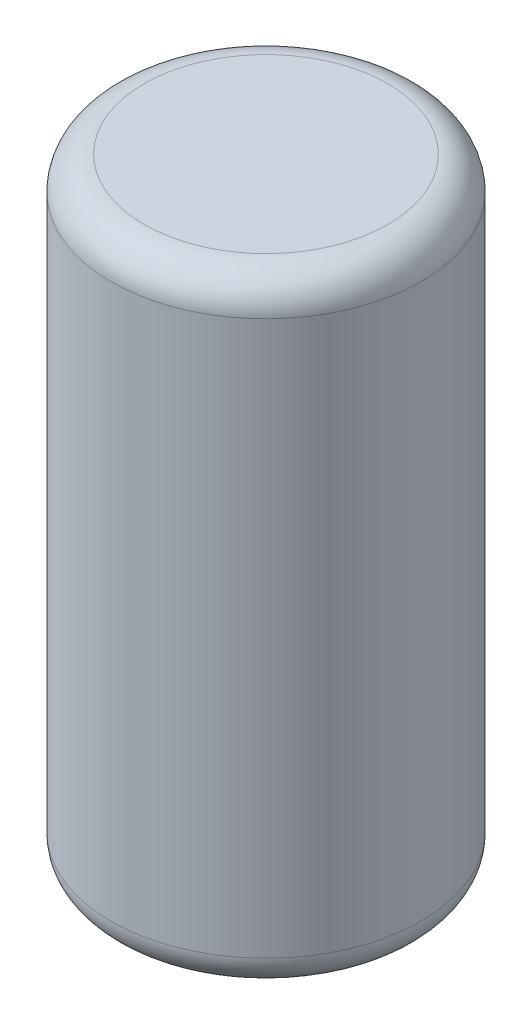
ISO-10303-21;
HEADER;
FILE_DESCRIPTION(('STEP AP214'),'2;1');
FILE_NAME('part.step','',(''),(''),'','','');
FILE_SCHEMA(('AUTOMOTIVE_DESIGN { 1 0 10303 214 1 1 1 1 }'));
ENDSEC;
DATA;
#1=APPLICATION_CONTEXT('core data for automotive mechanical design processes');
#2=APPLICATION_PROTOCOL_DEFINITION('international standard','automotive_design',2000,#1);
#3=PRODUCT_CONTEXT('',#1,'mechanical');
#4=PRODUCT('Part','Part','',(#3));
#5=PRODUCT_RELATED_PRODUCT_CATEGORY('part','',(#4));
#6=PRODUCT_DEFINITION_FORMATION('','',#4);
#7=PRODUCT_DEFINITION_CONTEXT('part definition',#1,'design');
#8=PRODUCT_DEFINITION('design','',#6,#7);
#9=PRODUCT_DEFINITION_SHAPE('','',#8);
#10=(LENGTH_UNIT() NAMED_UNIT(*) SI_UNIT(.MILLI.,.METRE.));
#11=(NAMED_UNIT(*) PLANE_ANGLE_UNIT() SI_UNIT($,.RADIAN.));
#12=(NAMED_UNIT(*) SI_UNIT($,.STERADIAN.) SOLID_ANGLE_UNIT());
#13=UNCERTAINTY_MEASURE_WITH_UNIT(LENGTH_MEASURE(1.E-05),#10,'distance_accuracy_value','');
#14=(GEOMETRIC_REPRESENTATION_CONTEXT(3) GLOBAL_UNCERTAINTY_ASSIGNED_CONTEXT((#13)) GLOBAL_UNIT_ASSIGNED_CONTEXT((#10,
#11,#12)) REPRESENTATION_CONTEXT('',''));
#15=CARTESIAN_POINT('',(0.,0.,0.));
#16=DIRECTION('',(0.,0.,1.));
#17=DIRECTION('',(1.,0.,0.));
#18=AXIS2_PLACEMENT_3D('',#15,#16,#17);
#19=CARTESIAN_POINT('',(0.,4.7625,0.));
#20=DIRECTION('',(0.,-1.,0.));
#21=DIRECTION('',(0.,0.,-1.));
#22=AXIS2_PLACEMENT_3D('',#19,#20,#21);
#23=CYLINDRICAL_SURFACE('',#22,1.190625);
#24=CARTESIAN_POINT('',(0.,0.253999999999999,0.));
#25=DIRECTION('',(0.,1.,0.));
#26=DIRECTION('',(0.,0.,1.));
#27=AXIS2_PLACEMENT_3D('',#24,#25,#26);
#28=CIRCLE('',#27,1.190625);
#29=CARTESIAN_POINT('',(0.,0.253999999999999,-1.190625));
#30=VERTEX_POINT('',#29);
#31=EDGE_CURVE('E42',#30,#30,#28,.T.);
#32=CARTESIAN_POINT('',(0.,4.5085,0.));
#33=DIRECTION('',(0.,1.,0.));
#34=DIRECTION('',(0.,0.,1.));
#35=AXIS2_PLACEMENT_3D('',#32,#33,#34);
#36=CIRCLE('',#35,1.190625);
#37=CARTESIAN_POINT('',(0.,4.5085,-1.190625));
#38=VERTEX_POINT('',#37);
#39=EDGE_CURVE('E46',#38,#38,#36,.F.);
#40=CARTESIAN_POINT('',(0.,0.253999999999999,-1.190625));
#41=CARTESIAN_POINT('',(0.,0.298317708333332,-1.190625));
#42=CARTESIAN_POINT('',(0.,0.342635416666666,-1.190625));
#43=CARTESIAN_POINT('',(0.,0.431270833333332,-1.190625));
#44=CARTESIAN_POINT('',(0.,0.475588541666665,-1.190625));
#45=CARTESIAN_POINT('',(0.,0.564223958333332,-1.190625));
#46=CARTESIAN_POINT('',(0.,0.608541666666666,-1.190625));
#47=CARTESIAN_POINT('',(0.,0.697177083333333,-1.190625));
#48=CARTESIAN_POINT('',(0.,0.741494791666666,-1.190625));
#49=CARTESIAN_POINT('',(0.,0.830130208333332,-1.190625));
#50=CARTESIAN_POINT('',(0.,0.874447916666665,-1.190625));
#51=CARTESIAN_POINT('',(0.,0.963083333333332,-1.190625));
#52=CARTESIAN_POINT('',(0.,1.00740104166667,-1.190625));
#53=CARTESIAN_POINT('',(0.,1.09603645833333,-1.190625));
#54=CARTESIAN_POINT('',(0.,1.14035416666667,-1.190625));
#55=CARTESIAN_POINT('',(0.,1.22898958333333,-1.190625));
#56=CARTESIAN_POINT('',(0.,1.27330729166667,-1.190625));
#57=CARTESIAN_POINT('',(0.,1.36194270833333,-1.190625));
#58=CARTESIAN_POINT('',(0.,1.40626041666667,-1.190625));
#59=CARTESIAN_POINT('',(0.,1.49489583333333,-1.190625));
#60=CARTESIAN_POINT('',(0.,1.53921354166667,-1.190625));
#61=CARTESIAN_POINT('',(0.,1.62784895833333,-1.190625));
#62=CARTESIAN_POINT('',(0.,1.67216666666667,-1.190625));
#63=CARTESIAN_POINT('',(0.,1.76080208333333,-1.190625));
#64=CARTESIAN_POINT('',(0.,1.80511979166667,-1.190625));
#65=CARTESIAN_POINT('',(0.,1.89375520833333,-1.190625));
#66=CARTESIAN_POINT('',(0.,1.93807291666667,-1.190625));
#67=CARTESIAN_POINT('',(0.,2.02670833333333,-1.190625));
#68=CARTESIAN_POINT('',(0.,2.07102604166667,-1.190625));
#69=CARTESIAN_POINT('',(0.,2.15966145833333,-1.190625));
#70=CARTESIAN_POINT('',(0.,2.20397916666667,-1.190625));
#71=CARTESIAN_POINT('',(0.,2.29261458333333,-1.190625));
#72=CARTESIAN_POINT('',(0.,2.33693229166667,-1.190625));
#73=CARTESIAN_POINT('',(0.,2.42556770833333,-1.190625));
#74=CARTESIAN_POINT('',(0.,2.46988541666667,-1.190625));
#75=CARTESIAN_POINT('',(0.,2.55852083333333,-1.190625));
#76=CARTESIAN_POINT('',(0.,2.60283854166667,-1.190625));
#77=CARTESIAN_POINT('',(0.,2.69147395833333,-1.190625));
#78=CARTESIAN_POINT('',(0.,2.73579166666667,-1.190625));
#79=CARTESIAN_POINT('',(0.,2.82442708333333,-1.190625));
#80=CARTESIAN_POINT('',(0.,2.86874479166667,-1.190625));
#81=CARTESIAN_POINT('',(0.,2.95738020833333,-1.190625));
#82=CARTESIAN_POINT('',(0.,3.00169791666667,-1.190625));
#83=CARTESIAN_POINT('',(0.,3.09033333333333,-1.190625));
#84=CARTESIAN_POINT('',(0.,3.13465104166667,-1.190625));
#85=CARTESIAN_POINT('',(0.,3.22328645833333,-1.190625));
#86=CARTESIAN_POINT('',(0.,3.26760416666667,-1.190625));
#87=CARTESIAN_POINT('',(0.,3.35623958333333,-1.190625));
#88=CARTESIAN_POINT('',(0.,3.40055729166667,-1.190625));
#89=CARTESIAN_POINT('',(0.,3.48919270833333,-1.190625));
#90=CARTESIAN_POINT('',(0.,3.53351041666667,-1.190625));
#91=CARTESIAN_POINT('',(0.,3.62214583333333,-1.190625));
#92=CARTESIAN_POINT('',(0.,3.66646354166667,-1.190625));
#93=CARTESIAN_POINT('',(0.,3.75509895833333,-1.190625));
#94=CARTESIAN_POINT('',(0.,3.79941666666667,-1.190625));
#95=CARTESIAN_POINT('',(0.,3.88805208333333,-1.190625));
#96=CARTESIAN_POINT('',(0.,3.93236979166667,-1.190625));
#97=CARTESIAN_POINT('',(0.,4.02100520833333,-1.190625));
#98=CARTESIAN_POINT('',(0.,4.06532291666667,-1.190625));
#99=CARTESIAN_POINT('',(0.,4.15395833333333,-1.190625));
#100=CARTESIAN_POINT('',(0.,4.19827604166667,-1.190625));
#101=CARTESIAN_POINT('',(0.,4.28691145833333,-1.190625));
#102=CARTESIAN_POINT('',(0.,4.33122916666667,-1.190625));
#103=CARTESIAN_POINT('',(0.,4.41986458333333,-1.190625));
#104=CARTESIAN_POINT('',(0.,4.46418229166667,-1.190625));
#105=CARTESIAN_POINT('',(0.,4.5085,-1.190625));
#106=B_SPLINE_CURVE_WITH_KNOTS('',3,(#40,#41,#42,#43,#44,#45,#46,#47,#48,#49,#50,#51,#52,#53,
#54,#55,#56,#57,#58,#59,#60,#61,#62,#63,#64,#65,#66,#67,#68,#69,#70,#71,#72,#73,#74,#75,#76,#77,
#78,#79,#80,#81,#82,#83,#84,#85,#86,#87,#88,#89,#90,#91,#92,#93,#94,#95,#96,#97,#98,#99,#100,
#101,#102,#103,#104,#105),.UNSPECIFIED.,.F.,.F.,(4,2,2,2,2,2,2,2,2,2,2,2,2,2,2,2,2,2,2,2,2,2,2,
2,2,2,2,2,2,2,2,2,4),(0.,0.132953125,0.26590625,0.398859375,0.5318125,0.664765625,0.79771875,
0.930671875,1.063625,1.196578125,1.32953125,1.462484375,1.5954375,1.728390625,1.86134375,
1.994296875,2.12725,2.260203125,2.39315625,2.526109375,2.6590625,2.792015625,2.92496875,
3.057921875,3.190875,3.323828125,3.45678125,3.589734375,3.7226875,3.855640625,3.98859375,
4.121546875,4.2545),.UNSPECIFIED.);
#107=EDGE_CURVE('BSEAM31',#30,#38,#106,.T.);
#108=ORIENTED_EDGE('',*,*,#31,.T.);
#109=ORIENTED_EDGE('',*,*,#39,.T.);
#110=ORIENTED_EDGE('',*,*,#107,.T.);
#111=ORIENTED_EDGE('',*,*,#107,.F.);
#112=EDGE_LOOP('',(#108,#110,#109,#111));
#113=FACE_BOUND('',#112,.T.);
#114=ADVANCED_FACE('F31',(#113),#23,.T.);
#115=CARTESIAN_POINT('',(0.,4.7625,0.));
#116=DIRECTION('',(0.,1.,0.));
#117=DIRECTION('',(0.,0.,1.));
#118=AXIS2_PLACEMENT_3D('',#115,#116,#117);
#119=PLANE('',#118);
#120=CARTESIAN_POINT('',(0.,4.7625,0.));
#121=DIRECTION('',(0.,1.,0.));
#122=DIRECTION('',(0.,0.,1.));
#123=AXIS2_PLACEMENT_3D('',#120,#121,#122);
#124=CIRCLE('',#123,0.936625);
#125=CARTESIAN_POINT('',(0.,4.7625,0.936625));
#126=VERTEX_POINT('',#125);
#127=EDGE_CURVE('E10',#126,#126,#124,.T.);
#128=ORIENTED_EDGE('',*,*,#127,.T.);
#129=EDGE_LOOP('',(#128));
#130=FACE_BOUND('',#129,.T.);
#131=ADVANCED_FACE('F62',(#130),#119,.T.);
#132=CARTESIAN_POINT('',(0.,0.,0.));
#133=DIRECTION('',(0.,1.,0.));
#134=DIRECTION('',(0.,0.,1.));
#135=AXIS2_PLACEMENT_3D('',#132,#133,#134);
#136=PLANE('',#135);
#137=CARTESIAN_POINT('',(0.,0.,0.));
#138=DIRECTION('',(0.,1.,0.));
#139=DIRECTION('',(0.,0.,1.));
#140=AXIS2_PLACEMENT_3D('',#137,#138,#139);
#141=CIRCLE('',#140,0.936625);
#142=CARTESIAN_POINT('',(0.,0.,0.936625));
#143=VERTEX_POINT('',#142);
#144=EDGE_CURVE('E38',#143,#143,#141,.F.);
#145=ORIENTED_EDGE('',*,*,#144,.T.);
#146=EDGE_LOOP('',(#145));
#147=FACE_BOUND('',#146,.T.);
#148=ADVANCED_FACE('F59',(#147),#136,.F.);
#149=CARTESIAN_POINT('',(0.,0.254,0.));
#150=DIRECTION('',(0.,1.,0.));
#151=DIRECTION('',(0.,0.,1.));
#152=AXIS2_PLACEMENT_3D('',#149,#150,#151);
#153=TOROIDAL_SURFACE('',#152,0.936625,0.254);
#154=ORIENTED_EDGE('',*,*,#144,.F.);
#155=EDGE_LOOP('',(#154));
#156=FACE_BOUND('',#155,.T.);
#157=ORIENTED_EDGE('',*,*,#31,.F.);
#158=EDGE_LOOP('',(#157));
#159=FACE_BOUND('',#158,.T.);
#160=ADVANCED_FACE('F55',(#156,#159),#153,.T.);
#161=CARTESIAN_POINT('',(0.,4.5085,0.));
#162=DIRECTION('',(0.,1.,0.));
#163=DIRECTION('',(0.,0.,1.));
#164=AXIS2_PLACEMENT_3D('',#161,#162,#163);
#165=TOROIDAL_SURFACE('',#164,0.936625,0.254);
#166=ORIENTED_EDGE('',*,*,#39,.F.);
#167=EDGE_LOOP('',(#166));
#168=FACE_BOUND('',#167,.T.);
#169=ORIENTED_EDGE('',*,*,#127,.F.);
#170=EDGE_LOOP('',(#169));
#171=FACE_BOUND('',#170,.T.);
#172=ADVANCED_FACE('F33',(#168,#171),#165,.T.);
#173=CLOSED_SHELL('',(#114,#131,#148,#160,#172));
#174=MANIFOLD_SOLID_BREP('B2',#173);
#175=ADVANCED_BREP_SHAPE_REPRESENTATION('',(#18,#174),#14);
#176=SHAPE_DEFINITION_REPRESENTATION(#9,#175);
ENDSEC;
END-ISO-10303-21;
